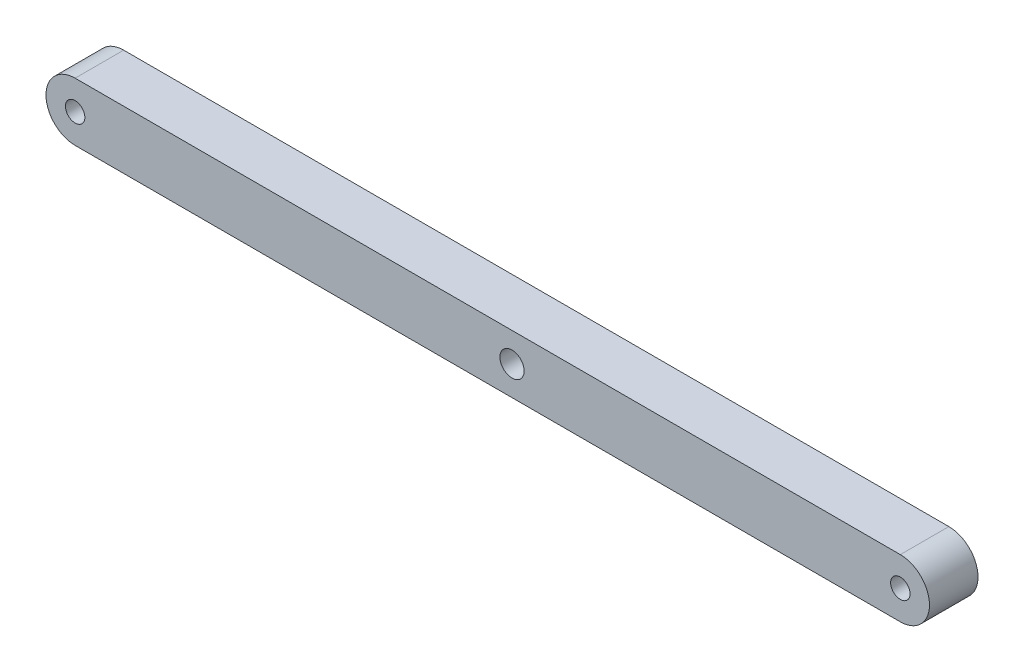
ISO-10303-21;
HEADER;
FILE_DESCRIPTION(('STEP AP214'),'2;1');
FILE_NAME('part.step','',(''),(''),'','','');
FILE_SCHEMA(('AUTOMOTIVE_DESIGN { 1 0 10303 214 1 1 1 1 }'));
ENDSEC;
DATA;
#1=APPLICATION_CONTEXT('core data for automotive mechanical design processes');
#2=APPLICATION_PROTOCOL_DEFINITION('international standard','automotive_design',2000,#1);
#3=PRODUCT_CONTEXT('',#1,'mechanical');
#4=PRODUCT('Part','Part','',(#3));
#5=PRODUCT_RELATED_PRODUCT_CATEGORY('part','',(#4));
#6=PRODUCT_DEFINITION_FORMATION('','',#4);
#7=PRODUCT_DEFINITION_CONTEXT('part definition',#1,'design');
#8=PRODUCT_DEFINITION('design','',#6,#7);
#9=PRODUCT_DEFINITION_SHAPE('','',#8);
#10=(LENGTH_UNIT() NAMED_UNIT(*) SI_UNIT(.MILLI.,.METRE.));
#11=(NAMED_UNIT(*) PLANE_ANGLE_UNIT() SI_UNIT($,.RADIAN.));
#12=(NAMED_UNIT(*) SI_UNIT($,.STERADIAN.) SOLID_ANGLE_UNIT());
#13=UNCERTAINTY_MEASURE_WITH_UNIT(LENGTH_MEASURE(1.E-05),#10,'distance_accuracy_value','');
#14=(GEOMETRIC_REPRESENTATION_CONTEXT(3) GLOBAL_UNCERTAINTY_ASSIGNED_CONTEXT((#13)) GLOBAL_UNIT_ASSIGNED_CONTEXT((#10,
#11,#12)) REPRESENTATION_CONTEXT('',''));
#15=CARTESIAN_POINT('',(0.,0.,0.));
#16=DIRECTION('',(0.,0.,1.));
#17=DIRECTION('',(1.,0.,0.));
#18=AXIS2_PLACEMENT_3D('',#15,#16,#17);
#19=CARTESIAN_POINT('',(0.,0.,5.));
#20=DIRECTION('',(0.,0.,1.));
#21=DIRECTION('',(1.,0.,0.));
#22=AXIS2_PLACEMENT_3D('',#19,#20,#21);
#23=PLANE('',#22);
#24=CARTESIAN_POINT('',(45.,0.,5.));
#25=DIRECTION('',(0.,0.,1.));
#26=DIRECTION('',(1.,0.,0.));
#27=AXIS2_PLACEMENT_3D('',#24,#25,#26);
#28=CIRCLE('',#27,1.25);
#29=CARTESIAN_POINT('',(46.25,0.,5.));
#30=VERTEX_POINT('',#29);
#31=EDGE_CURVE('E138',#30,#30,#28,.T.);
#32=ORIENTED_EDGE('',*,*,#31,.F.);
#33=EDGE_LOOP('',(#32));
#34=FACE_BOUND('',#33,.T.);
#35=CARTESIAN_POINT('',(0.,0.,5.));
#36=DIRECTION('',(0.,0.,1.));
#37=DIRECTION('',(1.,0.,0.));
#38=AXIS2_PLACEMENT_3D('',#35,#36,#37);
#39=CIRCLE('',#38,3.);
#40=CARTESIAN_POINT('',(0.,3.,5.));
#41=VERTEX_POINT('',#40);
#42=CARTESIAN_POINT('',(0.,-3.,5.));
#43=VERTEX_POINT('',#42);
#44=EDGE_CURVE('E96',#41,#43,#39,.T.);
#45=ORIENTED_EDGE('',*,*,#44,.T.);
#46=DIRECTION('',(1.,0.,0.));
#47=VECTOR('',#46,1.);
#48=CARTESIAN_POINT('',(85.,-2.99999999999999,5.));
#49=LINE('',#48,#47);
#50=CARTESIAN_POINT('',(85.,-2.99999999999999,5.));
#51=VERTEX_POINT('',#50);
#52=EDGE_CURVE('E91',#43,#51,#49,.T.);
#53=ORIENTED_EDGE('',*,*,#52,.T.);
#54=CARTESIAN_POINT('',(85.,0.,5.));
#55=DIRECTION('',(0.,0.,1.));
#56=DIRECTION('',(1.,0.,0.));
#57=AXIS2_PLACEMENT_3D('',#54,#55,#56);
#58=CIRCLE('',#57,2.99999999999999);
#59=CARTESIAN_POINT('',(85.,2.99999999999999,5.));
#60=VERTEX_POINT('',#59);
#61=EDGE_CURVE('E94',#51,#60,#58,.T.);
#62=ORIENTED_EDGE('',*,*,#61,.T.);
#63=DIRECTION('',(-1.,0.,0.));
#64=VECTOR('',#63,1.);
#65=CARTESIAN_POINT('',(0.,3.,5.));
#66=LINE('',#65,#64);
#67=EDGE_CURVE('E61',#60,#41,#66,.T.);
#68=ORIENTED_EDGE('',*,*,#67,.T.);
#69=EDGE_LOOP('',(#45,#53,#62,#68));
#70=FACE_BOUND('',#69,.T.);
#71=CARTESIAN_POINT('',(0.,0.,5.));
#72=DIRECTION('',(0.,0.,1.));
#73=DIRECTION('',(1.,0.,0.));
#74=AXIS2_PLACEMENT_3D('',#71,#72,#73);
#75=CIRCLE('',#74,1.);
#76=CARTESIAN_POINT('',(1.,0.,5.));
#77=VERTEX_POINT('',#76);
#78=EDGE_CURVE('E116',#77,#77,#75,.T.);
#79=ORIENTED_EDGE('',*,*,#78,.F.);
#80=EDGE_LOOP('',(#79));
#81=FACE_BOUND('',#80,.T.);
#82=CARTESIAN_POINT('',(85.,0.,5.));
#83=DIRECTION('',(0.,0.,1.));
#84=DIRECTION('',(1.,0.,0.));
#85=AXIS2_PLACEMENT_3D('',#82,#83,#84);
#86=CIRCLE('',#85,0.999999999999998);
#87=CARTESIAN_POINT('',(86.,0.,5.));
#88=VERTEX_POINT('',#87);
#89=EDGE_CURVE('E146',#88,#88,#86,.T.);
#90=ORIENTED_EDGE('',*,*,#89,.F.);
#91=EDGE_LOOP('',(#90));
#92=FACE_BOUND('',#91,.T.);
#93=ADVANCED_FACE('F43',(#34,#70,#81,#92),#23,.T.);
#94=CARTESIAN_POINT('',(0.,0.,0.));
#95=DIRECTION('',(0.,0.,1.));
#96=DIRECTION('',(1.,0.,0.));
#97=AXIS2_PLACEMENT_3D('',#94,#95,#96);
#98=PLANE('',#97);
#99=CARTESIAN_POINT('',(0.,0.,0.));
#100=DIRECTION('',(0.,0.,1.));
#101=DIRECTION('',(1.,0.,0.));
#102=AXIS2_PLACEMENT_3D('',#99,#100,#101);
#103=CIRCLE('',#102,3.);
#104=CARTESIAN_POINT('',(0.,3.,0.));
#105=VERTEX_POINT('',#104);
#106=CARTESIAN_POINT('',(0.,-3.,0.));
#107=VERTEX_POINT('',#106);
#108=EDGE_CURVE('E112',#105,#107,#103,.T.);
#109=ORIENTED_EDGE('',*,*,#108,.F.);
#110=DIRECTION('',(-1.,0.,0.));
#111=VECTOR('',#110,1.);
#112=CARTESIAN_POINT('',(0.,3.,0.));
#113=LINE('',#112,#111);
#114=CARTESIAN_POINT('',(85.,2.99999999999999,0.));
#115=VERTEX_POINT('',#114);
#116=EDGE_CURVE('E84',#115,#105,#113,.T.);
#117=ORIENTED_EDGE('',*,*,#116,.F.);
#118=CARTESIAN_POINT('',(85.,0.,0.));
#119=DIRECTION('',(0.,0.,1.));
#120=DIRECTION('',(1.,0.,0.));
#121=AXIS2_PLACEMENT_3D('',#118,#119,#120);
#122=CIRCLE('',#121,2.99999999999999);
#123=CARTESIAN_POINT('',(85.,-2.99999999999999,0.));
#124=VERTEX_POINT('',#123);
#125=EDGE_CURVE('E78',#124,#115,#122,.T.);
#126=ORIENTED_EDGE('',*,*,#125,.F.);
#127=DIRECTION('',(1.,0.,0.));
#128=VECTOR('',#127,1.);
#129=CARTESIAN_POINT('',(85.,-2.99999999999999,0.));
#130=LINE('',#129,#128);
#131=EDGE_CURVE('E101',#107,#124,#130,.T.);
#132=ORIENTED_EDGE('',*,*,#131,.F.);
#133=EDGE_LOOP('',(#109,#117,#126,#132));
#134=FACE_BOUND('',#133,.T.);
#135=CARTESIAN_POINT('',(0.,0.,0.));
#136=DIRECTION('',(0.,0.,1.));
#137=DIRECTION('',(1.,0.,0.));
#138=AXIS2_PLACEMENT_3D('',#135,#136,#137);
#139=CIRCLE('',#138,1.);
#140=CARTESIAN_POINT('',(1.,0.,0.));
#141=VERTEX_POINT('',#140);
#142=EDGE_CURVE('E134',#141,#141,#139,.T.);
#143=ORIENTED_EDGE('',*,*,#142,.T.);
#144=EDGE_LOOP('',(#143));
#145=FACE_BOUND('',#144,.T.);
#146=CARTESIAN_POINT('',(45.,0.,0.));
#147=DIRECTION('',(0.,0.,1.));
#148=DIRECTION('',(1.,0.,0.));
#149=AXIS2_PLACEMENT_3D('',#146,#147,#148);
#150=CIRCLE('',#149,1.25);
#151=CARTESIAN_POINT('',(46.25,0.,0.));
#152=VERTEX_POINT('',#151);
#153=EDGE_CURVE('E142',#152,#152,#150,.T.);
#154=ORIENTED_EDGE('',*,*,#153,.T.);
#155=EDGE_LOOP('',(#154));
#156=FACE_BOUND('',#155,.T.);
#157=CARTESIAN_POINT('',(85.,0.,0.));
#158=DIRECTION('',(0.,0.,1.));
#159=DIRECTION('',(1.,0.,0.));
#160=AXIS2_PLACEMENT_3D('',#157,#158,#159);
#161=CIRCLE('',#160,0.999999999999998);
#162=CARTESIAN_POINT('',(86.,0.,0.));
#163=VERTEX_POINT('',#162);
#164=EDGE_CURVE('E150',#163,#163,#161,.T.);
#165=ORIENTED_EDGE('',*,*,#164,.T.);
#166=EDGE_LOOP('',(#165));
#167=FACE_BOUND('',#166,.T.);
#168=ADVANCED_FACE('F129',(#134,#145,#156,#167),#98,.F.);
#169=CARTESIAN_POINT('',(0.,0.,5.));
#170=DIRECTION('',(0.,0.,-1.));
#171=DIRECTION('',(-1.,0.,0.));
#172=AXIS2_PLACEMENT_3D('',#169,#170,#171);
#173=CYLINDRICAL_SURFACE('',#172,3.);
#174=ORIENTED_EDGE('',*,*,#108,.T.);
#175=DIRECTION('',(0.,0.,-1.));
#176=VECTOR('',#175,1.);
#177=CARTESIAN_POINT('',(0.,-3.,5.));
#178=LINE('',#177,#176);
#179=EDGE_CURVE('E11',#43,#107,#178,.T.);
#180=ORIENTED_EDGE('',*,*,#179,.F.);
#181=ORIENTED_EDGE('',*,*,#44,.F.);
#182=DIRECTION('',(0.,0.,-1.));
#183=VECTOR('',#182,1.);
#184=CARTESIAN_POINT('',(0.,3.,5.));
#185=LINE('',#184,#183);
#186=EDGE_CURVE('E108',#41,#105,#185,.T.);
#187=ORIENTED_EDGE('',*,*,#186,.T.);
#188=EDGE_LOOP('',(#174,#180,#181,#187));
#189=FACE_BOUND('',#188,.T.);
#190=ADVANCED_FACE('F45',(#189),#173,.T.);
#191=CARTESIAN_POINT('',(85.,-2.99999999999999,5.));
#192=DIRECTION('',(0.,1.,0.));
#193=DIRECTION('',(-1.,0.,0.));
#194=AXIS2_PLACEMENT_3D('',#191,#192,#193);
#195=PLANE('',#194);
#196=ORIENTED_EDGE('',*,*,#131,.T.);
#197=DIRECTION('',(0.,0.,-1.));
#198=VECTOR('',#197,1.);
#199=CARTESIAN_POINT('',(85.,-2.99999999999999,5.));
#200=LINE('',#199,#198);
#201=EDGE_CURVE('E53',#51,#124,#200,.T.);
#202=ORIENTED_EDGE('',*,*,#201,.F.);
#203=ORIENTED_EDGE('',*,*,#52,.F.);
#204=ORIENTED_EDGE('',*,*,#179,.T.);
#205=EDGE_LOOP('',(#196,#202,#203,#204));
#206=FACE_BOUND('',#205,.T.);
#207=ADVANCED_FACE('F100',(#206),#195,.F.);
#208=CARTESIAN_POINT('',(85.,0.,5.));
#209=DIRECTION('',(0.,0.,-1.));
#210=DIRECTION('',(-1.,0.,0.));
#211=AXIS2_PLACEMENT_3D('',#208,#209,#210);
#212=CYLINDRICAL_SURFACE('',#211,2.99999999999999);
#213=ORIENTED_EDGE('',*,*,#125,.T.);
#214=DIRECTION('',(0.,0.,-1.));
#215=VECTOR('',#214,1.);
#216=CARTESIAN_POINT('',(85.,2.99999999999999,5.));
#217=LINE('',#216,#215);
#218=EDGE_CURVE('E103',#60,#115,#217,.T.);
#219=ORIENTED_EDGE('',*,*,#218,.F.);
#220=ORIENTED_EDGE('',*,*,#61,.F.);
#221=ORIENTED_EDGE('',*,*,#201,.T.);
#222=EDGE_LOOP('',(#213,#219,#220,#221));
#223=FACE_BOUND('',#222,.T.);
#224=ADVANCED_FACE('F104',(#223),#212,.T.);
#225=CARTESIAN_POINT('',(0.,3.,5.));
#226=DIRECTION('',(0.,-1.,0.));
#227=DIRECTION('',(1.,0.,0.));
#228=AXIS2_PLACEMENT_3D('',#225,#226,#227);
#229=PLANE('',#228);
#230=ORIENTED_EDGE('',*,*,#116,.T.);
#231=ORIENTED_EDGE('',*,*,#186,.F.);
#232=ORIENTED_EDGE('',*,*,#67,.F.);
#233=ORIENTED_EDGE('',*,*,#218,.T.);
#234=EDGE_LOOP('',(#230,#231,#232,#233));
#235=FACE_BOUND('',#234,.T.);
#236=ADVANCED_FACE('F126',(#235),#229,.F.);
#237=CARTESIAN_POINT('',(0.,0.,5.));
#238=DIRECTION('',(0.,0.,-1.));
#239=DIRECTION('',(-1.,0.,0.));
#240=AXIS2_PLACEMENT_3D('',#237,#238,#239);
#241=CYLINDRICAL_SURFACE('',#240,1.);
#242=ORIENTED_EDGE('',*,*,#78,.T.);
#243=EDGE_LOOP('',(#242));
#244=FACE_BOUND('',#243,.T.);
#245=ORIENTED_EDGE('',*,*,#142,.F.);
#246=EDGE_LOOP('',(#245));
#247=FACE_BOUND('',#246,.T.);
#248=ADVANCED_FACE('F170',(#244,#247),#241,.F.);
#249=CARTESIAN_POINT('',(45.,0.,5.));
#250=DIRECTION('',(0.,0.,-1.));
#251=DIRECTION('',(-1.,0.,0.));
#252=AXIS2_PLACEMENT_3D('',#249,#250,#251);
#253=CYLINDRICAL_SURFACE('',#252,1.25);
#254=ORIENTED_EDGE('',*,*,#31,.T.);
#255=EDGE_LOOP('',(#254));
#256=FACE_BOUND('',#255,.T.);
#257=ORIENTED_EDGE('',*,*,#153,.F.);
#258=EDGE_LOOP('',(#257));
#259=FACE_BOUND('',#258,.T.);
#260=ADVANCED_FACE('F224',(#256,#259),#253,.F.);
#261=CARTESIAN_POINT('',(85.,0.,5.));
#262=DIRECTION('',(0.,0.,-1.));
#263=DIRECTION('',(-1.,0.,0.));
#264=AXIS2_PLACEMENT_3D('',#261,#262,#263);
#265=CYLINDRICAL_SURFACE('',#264,0.999999999999998);
#266=ORIENTED_EDGE('',*,*,#89,.T.);
#267=EDGE_LOOP('',(#266));
#268=FACE_BOUND('',#267,.T.);
#269=ORIENTED_EDGE('',*,*,#164,.F.);
#270=EDGE_LOOP('',(#269));
#271=FACE_BOUND('',#270,.T.);
#272=ADVANCED_FACE('F158',(#268,#271),#265,.F.);
#273=CLOSED_SHELL('',(#93,#168,#190,#207,#224,#236,#248,#260,#272));
#274=MANIFOLD_SOLID_BREP('B2',#273);
#275=ADVANCED_BREP_SHAPE_REPRESENTATION('',(#18,#274),#14);
#276=SHAPE_DEFINITION_REPRESENTATION(#9,#275);
ENDSEC;
END-ISO-10303-21;
